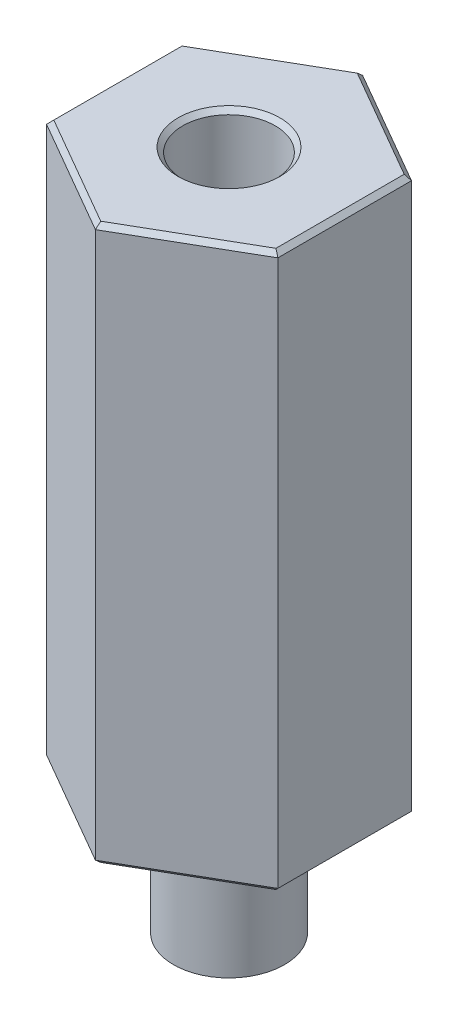
ISO-10303-21;
HEADER;
FILE_DESCRIPTION(('STEP AP214'),'2;1');
FILE_NAME('part.step','',(''),(''),'','','');
FILE_SCHEMA(('AUTOMOTIVE_DESIGN { 1 0 10303 214 1 1 1 1 }'));
ENDSEC;
DATA;
#1=APPLICATION_CONTEXT('core data for automotive mechanical design processes');
#2=APPLICATION_PROTOCOL_DEFINITION('international standard','automotive_design',2000,#1);
#3=PRODUCT_CONTEXT('',#1,'mechanical');
#4=PRODUCT('Part','Part','',(#3));
#5=PRODUCT_RELATED_PRODUCT_CATEGORY('part','',(#4));
#6=PRODUCT_DEFINITION_FORMATION('','',#4);
#7=PRODUCT_DEFINITION_CONTEXT('part definition',#1,'design');
#8=PRODUCT_DEFINITION('design','',#6,#7);
#9=PRODUCT_DEFINITION_SHAPE('','',#8);
#10=(LENGTH_UNIT() NAMED_UNIT(*) SI_UNIT(.MILLI.,.METRE.));
#11=(NAMED_UNIT(*) PLANE_ANGLE_UNIT() SI_UNIT($,.RADIAN.));
#12=(NAMED_UNIT(*) SI_UNIT($,.STERADIAN.) SOLID_ANGLE_UNIT());
#13=UNCERTAINTY_MEASURE_WITH_UNIT(LENGTH_MEASURE(1.E-05),#10,'distance_accuracy_value','');
#14=(GEOMETRIC_REPRESENTATION_CONTEXT(3) GLOBAL_UNCERTAINTY_ASSIGNED_CONTEXT((#13)) GLOBAL_UNIT_ASSIGNED_CONTEXT((#10,
#11,#12)) REPRESENTATION_CONTEXT('',''));
#15=CARTESIAN_POINT('',(0.,0.,0.));
#16=DIRECTION('',(0.,0.,1.));
#17=DIRECTION('',(1.,0.,0.));
#18=AXIS2_PLACEMENT_3D('',#15,#16,#17);
#19=CARTESIAN_POINT('',(0.,0.,0.));
#20=DIRECTION('',(0.,1.,0.));
#21=DIRECTION('',(0.,0.,1.));
#22=AXIS2_PLACEMENT_3D('',#19,#20,#21);
#23=CYLINDRICAL_SURFACE('',#22,1.);
#24=CARTESIAN_POINT('',(0.,11.9,0.));
#25=DIRECTION('',(0.,1.,0.));
#26=DIRECTION('',(0.,0.,1.));
#27=AXIS2_PLACEMENT_3D('',#24,#25,#26);
#28=CIRCLE('',#27,1.);
#29=CARTESIAN_POINT('',(0.,11.9,1.));
#30=VERTEX_POINT('',#29);
#31=EDGE_CURVE('E180',#30,#30,#28,.T.);
#32=ORIENTED_EDGE('',*,*,#31,.T.);
#33=EDGE_LOOP('',(#32));
#34=FACE_BOUND('',#33,.T.);
#35=CARTESIAN_POINT('',(0.,2.7,0.));
#36=DIRECTION('',(0.,-1.,0.));
#37=DIRECTION('',(0.,0.,-1.));
#38=AXIS2_PLACEMENT_3D('',#35,#36,#37);
#39=CIRCLE('',#38,1.);
#40=CARTESIAN_POINT('',(0.,2.7,-1.));
#41=VERTEX_POINT('',#40);
#42=EDGE_CURVE('E11',#41,#41,#39,.F.);
#43=ORIENTED_EDGE('',*,*,#42,.F.);
#44=EDGE_LOOP('',(#43));
#45=FACE_BOUND('',#44,.T.);
#46=ADVANCED_FACE('F33',(#34,#45),#23,.F.);
#47=CARTESIAN_POINT('',(2.49999999999998,12.,-1.44337567297409));
#48=DIRECTION('',(-0.499999999999995,0.,0.866025403784442));
#49=DIRECTION('',(0.866025403784442,0.,0.499999999999995));
#50=AXIS2_PLACEMENT_3D('',#47,#48,#49);
#51=PLANE('',#50);
#52=DIRECTION('',(0.,-1.,0.));
#53=VECTOR('',#52,1.);
#54=CARTESIAN_POINT('',(0.,12.,-2.88675134594812));
#55=LINE('',#54,#53);
#56=CARTESIAN_POINT('',(0.,11.9,-2.88675134594812));
#57=VERTEX_POINT('',#56);
#58=CARTESIAN_POINT('',(0.,0.100000000000001,-2.88675134594812));
#59=VERTEX_POINT('',#58);
#60=EDGE_CURVE('E251',#57,#59,#55,.T.);
#61=ORIENTED_EDGE('',*,*,#60,.F.);
#62=DIRECTION('',(0.866025403784442,0.,0.499999999999995));
#63=VECTOR('',#62,1.);
#64=CARTESIAN_POINT('',(2.49999999999998,11.9,-1.44337567297409));
#65=LINE('',#64,#63);
#66=CARTESIAN_POINT('',(2.49999999999998,11.9,-1.44337567297409));
#67=VERTEX_POINT('',#66);
#68=EDGE_CURVE('E178',#57,#67,#65,.T.);
#69=ORIENTED_EDGE('',*,*,#68,.T.);
#70=DIRECTION('',(0.,-1.,0.));
#71=VECTOR('',#70,1.);
#72=CARTESIAN_POINT('',(2.49999999999998,12.,-1.44337567297409));
#73=LINE('',#72,#71);
#74=CARTESIAN_POINT('',(2.49999999999998,0.100000000000001,-1.44337567297409));
#75=VERTEX_POINT('',#74);
#76=EDGE_CURVE('E203',#67,#75,#73,.T.);
#77=ORIENTED_EDGE('',*,*,#76,.T.);
#78=DIRECTION('',(-0.866025403784442,0.,-0.499999999999995));
#79=VECTOR('',#78,1.);
#80=CARTESIAN_POINT('',(2.49999999999998,0.100000000000001,-1.44337567297409));
#81=LINE('',#80,#79);
#82=EDGE_CURVE('E176',#75,#59,#81,.T.);
#83=ORIENTED_EDGE('',*,*,#82,.T.);
#84=EDGE_LOOP('',(#61,#69,#77,#83));
#85=FACE_BOUND('',#84,.T.);
#86=ADVANCED_FACE('F308',(#85),#51,.F.);
#87=CARTESIAN_POINT('',(0.,12.,-2.88675134594812));
#88=DIRECTION('',(0.500000000000001,0.,0.866025403784438));
#89=DIRECTION('',(0.866025403784438,0.,-0.500000000000001));
#90=AXIS2_PLACEMENT_3D('',#87,#88,#89);
#91=PLANE('',#90);
#92=DIRECTION('',(0.,-1.,0.));
#93=VECTOR('',#92,1.);
#94=CARTESIAN_POINT('',(-2.5,12.,-1.44337567297406));
#95=LINE('',#94,#93);
#96=CARTESIAN_POINT('',(-2.5,11.9,-1.44337567297406));
#97=VERTEX_POINT('',#96);
#98=CARTESIAN_POINT('',(-2.5,0.100000000000001,-1.44337567297406));
#99=VERTEX_POINT('',#98);
#100=EDGE_CURVE('E243',#97,#99,#95,.T.);
#101=ORIENTED_EDGE('',*,*,#100,.F.);
#102=DIRECTION('',(0.866025403784438,0.,-0.500000000000001));
#103=VECTOR('',#102,1.);
#104=CARTESIAN_POINT('',(0.,11.9,-2.88675134594812));
#105=LINE('',#104,#103);
#106=EDGE_CURVE('E174',#97,#57,#105,.T.);
#107=ORIENTED_EDGE('',*,*,#106,.T.);
#108=ORIENTED_EDGE('',*,*,#60,.T.);
#109=DIRECTION('',(-0.866025403784438,0.,0.500000000000001));
#110=VECTOR('',#109,1.);
#111=CARTESIAN_POINT('',(0.,0.100000000000001,-2.88675134594812));
#112=LINE('',#111,#110);
#113=EDGE_CURVE('E172',#59,#99,#112,.T.);
#114=ORIENTED_EDGE('',*,*,#113,.T.);
#115=EDGE_LOOP('',(#101,#107,#108,#114));
#116=FACE_BOUND('',#115,.T.);
#117=ADVANCED_FACE('F313',(#116),#91,.F.);
#118=CARTESIAN_POINT('',(-2.5,12.,-1.44337567297406));
#119=DIRECTION('',(1.,0.,0.));
#120=DIRECTION('',(0.,0.,-1.));
#121=AXIS2_PLACEMENT_3D('',#118,#119,#120);
#122=PLANE('',#121);
#123=DIRECTION('',(0.,-1.,0.));
#124=VECTOR('',#123,1.);
#125=CARTESIAN_POINT('',(-2.49999999999999,12.,1.44337567297407));
#126=LINE('',#125,#124);
#127=CARTESIAN_POINT('',(-2.49999999999999,11.9,1.44337567297407));
#128=VERTEX_POINT('',#127);
#129=CARTESIAN_POINT('',(-2.49999999999999,0.100000000000001,1.44337567297407));
#130=VERTEX_POINT('',#129);
#131=EDGE_CURVE('E240',#128,#130,#126,.T.);
#132=ORIENTED_EDGE('',*,*,#131,.F.);
#133=DIRECTION('',(0.,0.,-1.));
#134=VECTOR('',#133,1.);
#135=CARTESIAN_POINT('',(-2.5,11.9,-1.44337567297406));
#136=LINE('',#135,#134);
#137=EDGE_CURVE('E170',#128,#97,#136,.T.);
#138=ORIENTED_EDGE('',*,*,#137,.T.);
#139=ORIENTED_EDGE('',*,*,#100,.T.);
#140=DIRECTION('',(0.,0.,1.));
#141=VECTOR('',#140,1.);
#142=CARTESIAN_POINT('',(-2.5,0.100000000000001,-1.44337567297406));
#143=LINE('',#142,#141);
#144=EDGE_CURVE('E168',#99,#130,#143,.T.);
#145=ORIENTED_EDGE('',*,*,#144,.T.);
#146=EDGE_LOOP('',(#132,#138,#139,#145));
#147=FACE_BOUND('',#146,.T.);
#148=ADVANCED_FACE('F239',(#147),#122,.F.);
#149=CARTESIAN_POINT('',(-2.49999999999999,12.,1.44337567297407));
#150=DIRECTION('',(0.499999999999995,0.,-0.866025403784442));
#151=DIRECTION('',(-0.866025403784442,0.,-0.499999999999995));
#152=AXIS2_PLACEMENT_3D('',#149,#150,#151);
#153=PLANE('',#152);
#154=DIRECTION('',(0.,-1.,0.));
#155=VECTOR('',#154,1.);
#156=CARTESIAN_POINT('',(0.,12.,2.88675134594812));
#157=LINE('',#156,#155);
#158=CARTESIAN_POINT('',(0.,11.9,2.88675134594812));
#159=VERTEX_POINT('',#158);
#160=CARTESIAN_POINT('',(0.,0.100000000000001,2.88675134594812));
#161=VERTEX_POINT('',#160);
#162=EDGE_CURVE('E249',#159,#161,#157,.T.);
#163=ORIENTED_EDGE('',*,*,#162,.F.);
#164=DIRECTION('',(-0.866025403784442,0.,-0.499999999999995));
#165=VECTOR('',#164,1.);
#166=CARTESIAN_POINT('',(-2.49999999999999,11.9,1.44337567297407));
#167=LINE('',#166,#165);
#168=EDGE_CURVE('E166',#159,#128,#167,.T.);
#169=ORIENTED_EDGE('',*,*,#168,.T.);
#170=ORIENTED_EDGE('',*,*,#131,.T.);
#171=DIRECTION('',(0.866025403784442,0.,0.499999999999995));
#172=VECTOR('',#171,1.);
#173=CARTESIAN_POINT('',(-2.49999999999999,0.100000000000001,1.44337567297407));
#174=LINE('',#173,#172);
#175=EDGE_CURVE('E163',#130,#161,#174,.T.);
#176=ORIENTED_EDGE('',*,*,#175,.T.);
#177=EDGE_LOOP('',(#163,#169,#170,#176));
#178=FACE_BOUND('',#177,.T.);
#179=ADVANCED_FACE('F246',(#178),#153,.F.);
#180=CARTESIAN_POINT('',(0.,12.,2.88675134594812));
#181=DIRECTION('',(-0.500000000000007,0.,-0.866025403784434));
#182=DIRECTION('',(-0.866025403784435,0.,0.500000000000007));
#183=AXIS2_PLACEMENT_3D('',#180,#181,#182);
#184=PLANE('',#183);
#185=DIRECTION('',(0.,-1.,0.));
#186=VECTOR('',#185,1.);
#187=CARTESIAN_POINT('',(2.50000000000001,12.,1.44337567297404));
#188=LINE('',#187,#186);
#189=CARTESIAN_POINT('',(2.50000000000001,11.9,1.44337567297404));
#190=VERTEX_POINT('',#189);
#191=CARTESIAN_POINT('',(2.50000000000001,0.100000000000001,1.44337567297404));
#192=VERTEX_POINT('',#191);
#193=EDGE_CURVE('E253',#190,#192,#188,.T.);
#194=ORIENTED_EDGE('',*,*,#193,.F.);
#195=DIRECTION('',(-0.866025403784435,0.,0.500000000000007));
#196=VECTOR('',#195,1.);
#197=CARTESIAN_POINT('',(0.,11.9,2.88675134594812));
#198=LINE('',#197,#196);
#199=EDGE_CURVE('E161',#190,#159,#198,.T.);
#200=ORIENTED_EDGE('',*,*,#199,.T.);
#201=ORIENTED_EDGE('',*,*,#162,.T.);
#202=DIRECTION('',(0.866025403784435,0.,-0.500000000000007));
#203=VECTOR('',#202,1.);
#204=CARTESIAN_POINT('',(0.,0.100000000000001,2.88675134594812));
#205=LINE('',#204,#203);
#206=EDGE_CURVE('E159',#161,#192,#205,.T.);
#207=ORIENTED_EDGE('',*,*,#206,.T.);
#208=EDGE_LOOP('',(#194,#200,#201,#207));
#209=FACE_BOUND('',#208,.T.);
#210=ADVANCED_FACE('F280',(#209),#184,.F.);
#211=CARTESIAN_POINT('',(2.50000000000001,12.,1.44337567297404));
#212=DIRECTION('',(-1.,0.,0.));
#213=DIRECTION('',(0.,0.,1.));
#214=AXIS2_PLACEMENT_3D('',#211,#212,#213);
#215=PLANE('',#214);
#216=ORIENTED_EDGE('',*,*,#76,.F.);
#217=DIRECTION('',(0.,0.,1.));
#218=VECTOR('',#217,1.);
#219=CARTESIAN_POINT('',(2.50000000000001,11.9,1.44337567297404));
#220=LINE('',#219,#218);
#221=EDGE_CURVE('E130',#67,#190,#220,.T.);
#222=ORIENTED_EDGE('',*,*,#221,.T.);
#223=ORIENTED_EDGE('',*,*,#193,.T.);
#224=DIRECTION('',(0.,0.,-1.));
#225=VECTOR('',#224,1.);
#226=CARTESIAN_POINT('',(2.50000000000001,0.100000000000001,1.44337567297404));
#227=LINE('',#226,#225);
#228=EDGE_CURVE('E151',#192,#75,#227,.T.);
#229=ORIENTED_EDGE('',*,*,#228,.T.);
#230=EDGE_LOOP('',(#216,#222,#223,#229));
#231=FACE_BOUND('',#230,.T.);
#232=ADVANCED_FACE('F277',(#231),#215,.F.);
#233=CARTESIAN_POINT('',(0.,12.,0.));
#234=DIRECTION('',(0.,1.,0.));
#235=DIRECTION('',(0.,0.,1.));
#236=AXIS2_PLACEMENT_3D('',#233,#234,#235);
#237=PLANE('',#236);
#238=DIRECTION('',(0.866025403784435,0.,-0.500000000000007));
#239=VECTOR('',#238,1.);
#240=CARTESIAN_POINT('',(2.45000000000001,12.,1.35677313259559));
#241=LINE('',#240,#239);
#242=CARTESIAN_POINT('',(0.,12.,2.7712812921102));
#243=VERTEX_POINT('',#242);
#244=CARTESIAN_POINT('',(2.40000000000001,12.,1.38564064605508));
#245=VERTEX_POINT('',#244);
#246=EDGE_CURVE('E149',#243,#245,#241,.T.);
#247=ORIENTED_EDGE('',*,*,#246,.T.);
#248=DIRECTION('',(0.,0.,-1.));
#249=VECTOR('',#248,1.);
#250=CARTESIAN_POINT('',(2.39999999999998,12.,-1.44337567297409));
#251=LINE('',#250,#249);
#252=CARTESIAN_POINT('',(2.39999999999998,12.,-1.38564064605513));
#253=VERTEX_POINT('',#252);
#254=EDGE_CURVE('E128',#245,#253,#251,.T.);
#255=ORIENTED_EDGE('',*,*,#254,.T.);
#256=DIRECTION('',(-0.866025403784442,0.,-0.499999999999995));
#257=VECTOR('',#256,1.);
#258=CARTESIAN_POINT('',(-0.05,12.,-2.80014880556968));
#259=LINE('',#258,#257);
#260=CARTESIAN_POINT('',(0.,12.,-2.7712812921102));
#261=VERTEX_POINT('',#260);
#262=EDGE_CURVE('E137',#253,#261,#259,.T.);
#263=ORIENTED_EDGE('',*,*,#262,.T.);
#264=DIRECTION('',(-0.866025403784438,0.,0.500000000000001));
#265=VECTOR('',#264,1.);
#266=CARTESIAN_POINT('',(-2.45,12.,-1.35677313259561));
#267=LINE('',#266,#265);
#268=CARTESIAN_POINT('',(-2.4,12.,-1.38564064605509));
#269=VERTEX_POINT('',#268);
#270=EDGE_CURVE('E143',#261,#269,#267,.T.);
#271=ORIENTED_EDGE('',*,*,#270,.T.);
#272=DIRECTION('',(0.,0.,1.));
#273=VECTOR('',#272,1.);
#274=CARTESIAN_POINT('',(-2.39999999999999,12.,1.44337567297407));
#275=LINE('',#274,#273);
#276=CARTESIAN_POINT('',(-2.39999999999999,12.,1.38564064605511));
#277=VERTEX_POINT('',#276);
#278=EDGE_CURVE('E262',#269,#277,#275,.T.);
#279=ORIENTED_EDGE('',*,*,#278,.T.);
#280=DIRECTION('',(0.866025403784442,0.,0.499999999999995));
#281=VECTOR('',#280,1.);
#282=CARTESIAN_POINT('',(0.0500000000000196,12.,2.80014880556968));
#283=LINE('',#282,#281);
#284=EDGE_CURVE('E154',#277,#243,#283,.T.);
#285=ORIENTED_EDGE('',*,*,#284,.T.);
#286=EDGE_LOOP('',(#247,#255,#263,#271,#279,#285));
#287=FACE_BOUND('',#286,.T.);
#288=CARTESIAN_POINT('',(0.,12.,0.));
#289=DIRECTION('',(0.,1.,0.));
#290=DIRECTION('',(0.,0.,1.));
#291=AXIS2_PLACEMENT_3D('',#288,#289,#290);
#292=CIRCLE('',#291,1.1);
#293=CARTESIAN_POINT('',(0.,12.,1.1));
#294=VERTEX_POINT('',#293);
#295=EDGE_CURVE('E144',#294,#294,#292,.F.);
#296=ORIENTED_EDGE('',*,*,#295,.T.);
#297=EDGE_LOOP('',(#296));
#298=FACE_BOUND('',#297,.T.);
#299=ADVANCED_FACE('F146',(#287,#298),#237,.T.);
#300=CARTESIAN_POINT('',(0.,0.,0.));
#301=DIRECTION('',(0.,1.,0.));
#302=DIRECTION('',(0.,0.,1.));
#303=AXIS2_PLACEMENT_3D('',#300,#301,#302);
#304=PLANE('',#303);
#305=CARTESIAN_POINT('',(0.,0.,0.));
#306=DIRECTION('',(0.,1.,0.));
#307=DIRECTION('',(0.,0.,1.));
#308=AXIS2_PLACEMENT_3D('',#305,#306,#307);
#309=CIRCLE('',#308,1.2);
#310=CARTESIAN_POINT('',(0.,0.,-1.2));
#311=VERTEX_POINT('',#310);
#312=EDGE_CURVE('E37',#311,#311,#309,.T.);
#313=ORIENTED_EDGE('',*,*,#312,.T.);
#314=EDGE_LOOP('',(#313));
#315=FACE_BOUND('',#314,.T.);
#316=DIRECTION('',(-0.866025403784435,0.,0.500000000000007));
#317=VECTOR('',#316,1.);
#318=CARTESIAN_POINT('',(1.20000000000001,0.,2.07846096908264));
#319=LINE('',#318,#317);
#320=CARTESIAN_POINT('',(2.40000000000001,0.,1.38564064605508));
#321=VERTEX_POINT('',#320);
#322=CARTESIAN_POINT('',(0.,0.,2.7712812921102));
#323=VERTEX_POINT('',#322);
#324=EDGE_CURVE('E49',#321,#323,#319,.T.);
#325=ORIENTED_EDGE('',*,*,#324,.T.);
#326=DIRECTION('',(-0.866025403784442,0.,-0.499999999999995));
#327=VECTOR('',#326,1.);
#328=CARTESIAN_POINT('',(-1.19999999999998,0.,2.07846096908265));
#329=LINE('',#328,#327);
#330=CARTESIAN_POINT('',(-2.39999999999999,0.,1.38564064605511));
#331=VERTEX_POINT('',#330);
#332=EDGE_CURVE('E42',#323,#331,#329,.T.);
#333=ORIENTED_EDGE('',*,*,#332,.T.);
#334=DIRECTION('',(0.,0.,-1.));
#335=VECTOR('',#334,1.);
#336=CARTESIAN_POINT('',(-2.39999999999999,0.,0.));
#337=LINE('',#336,#335);
#338=CARTESIAN_POINT('',(-2.4,0.,-1.38564064605509));
#339=VERTEX_POINT('',#338);
#340=EDGE_CURVE('E183',#331,#339,#337,.T.);
#341=ORIENTED_EDGE('',*,*,#340,.T.);
#342=DIRECTION('',(0.866025403784438,0.,-0.500000000000001));
#343=VECTOR('',#342,1.);
#344=CARTESIAN_POINT('',(-1.2,0.,-2.07846096908265));
#345=LINE('',#344,#343);
#346=CARTESIAN_POINT('',(0.,0.,-2.7712812921102));
#347=VERTEX_POINT('',#346);
#348=EDGE_CURVE('E185',#339,#347,#345,.T.);
#349=ORIENTED_EDGE('',*,*,#348,.T.);
#350=DIRECTION('',(0.866025403784442,0.,0.499999999999995));
#351=VECTOR('',#350,1.);
#352=CARTESIAN_POINT('',(1.19999999999999,0.,-2.07846096908266));
#353=LINE('',#352,#351);
#354=CARTESIAN_POINT('',(2.39999999999998,0.,-1.38564064605513));
#355=VERTEX_POINT('',#354);
#356=EDGE_CURVE('E187',#347,#355,#353,.T.);
#357=ORIENTED_EDGE('',*,*,#356,.T.);
#358=DIRECTION('',(0.,0.,1.));
#359=VECTOR('',#358,1.);
#360=CARTESIAN_POINT('',(2.39999999999999,0.,0.));
#361=LINE('',#360,#359);
#362=EDGE_CURVE('E54',#355,#321,#361,.T.);
#363=ORIENTED_EDGE('',*,*,#362,.T.);
#364=EDGE_LOOP('',(#325,#333,#341,#349,#357,#363));
#365=FACE_BOUND('',#364,.T.);
#366=ADVANCED_FACE('F228',(#315,#365),#304,.F.);
#367=CARTESIAN_POINT('',(-2.39999999999999,12.,0.));
#368=DIRECTION('',(-0.707106781186549,0.707106781186546,0.));
#369=DIRECTION('',(0.,0.,-1.));
#370=AXIS2_PLACEMENT_3D('',#367,#368,#369);
#371=PLANE('',#370);
#372=DIRECTION('',(0.654653670707977,0.654653670707978,0.377964473009226));
#373=VECTOR('',#372,1.);
#374=CARTESIAN_POINT('',(-2.05714285714286,12.3428571428571,-1.18769198233294));
#375=LINE('',#374,#373);
#376=EDGE_CURVE('E197',#97,#269,#375,.T.);
#377=ORIENTED_EDGE('',*,*,#376,.F.);
#378=ORIENTED_EDGE('',*,*,#137,.F.);
#379=DIRECTION('',(0.654653670707975,0.65465367070798,-0.377964473009226));
#380=VECTOR('',#379,1.);
#381=CARTESIAN_POINT('',(-2.05714285714285,12.3428571428571,1.18769198233296));
#382=LINE('',#381,#380);
#383=EDGE_CURVE('E200',#277,#128,#382,.F.);
#384=ORIENTED_EDGE('',*,*,#383,.F.);
#385=ORIENTED_EDGE('',*,*,#278,.F.);
#386=EDGE_LOOP('',(#377,#378,#384,#385));
#387=FACE_BOUND('',#386,.T.);
#388=ADVANCED_FACE('F322',(#387),#371,.T.);
#389=CARTESIAN_POINT('',(-1.19999999999999,12.,2.07846096908265));
#390=DIRECTION('',(-0.353553390593272,0.707106781186544,0.612372435695799));
#391=DIRECTION('',(-0.866025403784442,0.,-0.499999999999995));
#392=AXIS2_PLACEMENT_3D('',#389,#390,#391);
#393=PLANE('',#392);
#394=ORIENTED_EDGE('',*,*,#383,.T.);
#395=ORIENTED_EDGE('',*,*,#168,.F.);
#396=DIRECTION('',(0.,0.654653670707979,-0.755928946018453));
#397=VECTOR('',#396,1.);
#398=CARTESIAN_POINT('',(0.,12.3428571428571,2.37538396466588));
#399=LINE('',#398,#397);
#400=EDGE_CURVE('E194',#243,#159,#399,.F.);
#401=ORIENTED_EDGE('',*,*,#400,.F.);
#402=ORIENTED_EDGE('',*,*,#284,.F.);
#403=EDGE_LOOP('',(#394,#395,#401,#402));
#404=FACE_BOUND('',#403,.T.);
#405=ADVANCED_FACE('F268',(#404),#393,.T.);
#406=CARTESIAN_POINT('',(-1.2,12.,-2.07846096908265));
#407=DIRECTION('',(-0.353553390593275,0.707106781186546,-0.612372435695795));
#408=DIRECTION('',(0.866025403784438,0.,-0.500000000000001));
#409=AXIS2_PLACEMENT_3D('',#406,#407,#408);
#410=PLANE('',#409);
#411=ORIENTED_EDGE('',*,*,#376,.T.);
#412=ORIENTED_EDGE('',*,*,#270,.F.);
#413=DIRECTION('',(0.,0.654653670707979,0.755928946018453));
#414=VECTOR('',#413,1.);
#415=CARTESIAN_POINT('',(0.,12.3428571428571,-2.37538396466589));
#416=LINE('',#415,#414);
#417=EDGE_CURVE('E140',#57,#261,#416,.T.);
#418=ORIENTED_EDGE('',*,*,#417,.F.);
#419=ORIENTED_EDGE('',*,*,#106,.F.);
#420=EDGE_LOOP('',(#411,#412,#418,#419));
#421=FACE_BOUND('',#420,.T.);
#422=ADVANCED_FACE('F341',(#421),#410,.T.);
#423=CARTESIAN_POINT('',(1.20000000000001,12.,2.07846096908264));
#424=DIRECTION('',(0.353553390593279,0.707106781186547,0.612372435695792));
#425=DIRECTION('',(-0.866025403784435,0.,0.500000000000007));
#426=AXIS2_PLACEMENT_3D('',#423,#424,#425);
#427=PLANE('',#426);
#428=ORIENTED_EDGE('',*,*,#400,.T.);
#429=ORIENTED_EDGE('',*,*,#199,.F.);
#430=DIRECTION('',(-0.654653670707976,0.654653670707979,-0.377964473009226));
#431=VECTOR('',#430,1.);
#432=CARTESIAN_POINT('',(2.05714285714287,12.3428571428571,1.18769198233292));
#433=LINE('',#432,#431);
#434=EDGE_CURVE('E133',#245,#190,#433,.F.);
#435=ORIENTED_EDGE('',*,*,#434,.F.);
#436=ORIENTED_EDGE('',*,*,#246,.F.);
#437=EDGE_LOOP('',(#428,#429,#435,#436));
#438=FACE_BOUND('',#437,.T.);
#439=ADVANCED_FACE('F271',(#438),#427,.T.);
#440=CARTESIAN_POINT('',(1.19999999999999,12.,-2.07846096908266));
#441=DIRECTION('',(0.353553390593271,0.707106781186546,-0.612372435695798));
#442=DIRECTION('',(0.866025403784442,0.,0.499999999999995));
#443=AXIS2_PLACEMENT_3D('',#440,#441,#442);
#444=PLANE('',#443);
#445=ORIENTED_EDGE('',*,*,#417,.T.);
#446=ORIENTED_EDGE('',*,*,#262,.F.);
#447=DIRECTION('',(0.654653670707969,-0.65465367070798,-0.377964473009235));
#448=VECTOR('',#447,1.);
#449=CARTESIAN_POINT('',(2.05714285714285,12.3428571428571,-1.18769198233297));
#450=LINE('',#449,#448);
#451=EDGE_CURVE('E124',#67,#253,#450,.F.);
#452=ORIENTED_EDGE('',*,*,#451,.F.);
#453=ORIENTED_EDGE('',*,*,#68,.F.);
#454=EDGE_LOOP('',(#445,#446,#452,#453));
#455=FACE_BOUND('',#454,.T.);
#456=ADVANCED_FACE('F138',(#455),#444,.T.);
#457=CARTESIAN_POINT('',(2.39999999999999,12.,0.));
#458=DIRECTION('',(0.707106781186551,0.707106781186544,0.));
#459=DIRECTION('',(0.,0.,1.));
#460=AXIS2_PLACEMENT_3D('',#457,#458,#459);
#461=PLANE('',#460);
#462=ORIENTED_EDGE('',*,*,#434,.T.);
#463=ORIENTED_EDGE('',*,*,#221,.F.);
#464=ORIENTED_EDGE('',*,*,#451,.T.);
#465=ORIENTED_EDGE('',*,*,#254,.F.);
#466=EDGE_LOOP('',(#462,#463,#464,#465));
#467=FACE_BOUND('',#466,.T.);
#468=ADVANCED_FACE('F126',(#467),#461,.T.);
#469=CARTESIAN_POINT('',(0.,11.9,0.));
#470=DIRECTION('',(0.,1.,0.));
#471=DIRECTION('',(0.,0.,1.));
#472=AXIS2_PLACEMENT_3D('',#469,#470,#471);
#473=CONICAL_SURFACE('',#472,1.,0.785398163397444);
#474=ORIENTED_EDGE('',*,*,#295,.F.);
#475=EDGE_LOOP('',(#474));
#476=FACE_BOUND('',#475,.T.);
#477=ORIENTED_EDGE('',*,*,#31,.F.);
#478=EDGE_LOOP('',(#477));
#479=FACE_BOUND('',#478,.T.);
#480=ADVANCED_FACE('F336',(#476,#479),#473,.F.);
#481=CARTESIAN_POINT('',(2.49999999999998,0.100000000000001,-1.44337567297409));
#482=DIRECTION('',(-0.353553390593271,0.707106781186546,0.612372435695798));
#483=DIRECTION('',(-0.866025403784442,0.,-0.499999999999995));
#484=AXIS2_PLACEMENT_3D('',#481,#482,#483);
#485=PLANE('',#484);
#486=DIRECTION('',(-0.654653670707973,-0.654653670707979,0.377964473009231));
#487=VECTOR('',#486,1.);
#488=CARTESIAN_POINT('',(2.49999999999998,0.100000000000001,-1.44337567297409));
#489=LINE('',#488,#487);
#490=EDGE_CURVE('E214',#355,#75,#489,.F.);
#491=ORIENTED_EDGE('',*,*,#490,.F.);
#492=ORIENTED_EDGE('',*,*,#356,.F.);
#493=DIRECTION('',(0.,-0.654653670707979,0.755928946018453));
#494=VECTOR('',#493,1.);
#495=CARTESIAN_POINT('',(0.,0.100000000000001,-2.88675134594812));
#496=LINE('',#495,#494);
#497=EDGE_CURVE('E134',#59,#347,#496,.T.);
#498=ORIENTED_EDGE('',*,*,#497,.F.);
#499=ORIENTED_EDGE('',*,*,#82,.F.);
#500=EDGE_LOOP('',(#491,#492,#498,#499));
#501=FACE_BOUND('',#500,.T.);
#502=ADVANCED_FACE('F35',(#501),#485,.F.);
#503=CARTESIAN_POINT('',(0.,0.100000000000001,-2.88675134594812));
#504=DIRECTION('',(0.353553390593275,0.707106781186546,0.612372435695795));
#505=DIRECTION('',(-0.866025403784438,0.,0.500000000000001));
#506=AXIS2_PLACEMENT_3D('',#503,#504,#505);
#507=PLANE('',#506);
#508=ORIENTED_EDGE('',*,*,#497,.T.);
#509=ORIENTED_EDGE('',*,*,#348,.F.);
#510=DIRECTION('',(0.654653670707979,-0.654653670707978,0.377964473009224));
#511=VECTOR('',#510,1.);
#512=CARTESIAN_POINT('',(-2.5,0.100000000000001,-1.44337567297406));
#513=LINE('',#512,#511);
#514=EDGE_CURVE('E211',#99,#339,#513,.T.);
#515=ORIENTED_EDGE('',*,*,#514,.F.);
#516=ORIENTED_EDGE('',*,*,#113,.F.);
#517=EDGE_LOOP('',(#508,#509,#515,#516));
#518=FACE_BOUND('',#517,.T.);
#519=ADVANCED_FACE('F222',(#518),#507,.F.);
#520=CARTESIAN_POINT('',(2.50000000000001,0.100000000000001,1.44337567297404));
#521=DIRECTION('',(-0.707106781186548,0.707106781186547,0.));
#522=DIRECTION('',(0.,0.,-1.));
#523=AXIS2_PLACEMENT_3D('',#520,#521,#522);
#524=PLANE('',#523);
#525=ORIENTED_EDGE('',*,*,#490,.T.);
#526=ORIENTED_EDGE('',*,*,#228,.F.);
#527=DIRECTION('',(-0.65465367070798,-0.654653670707977,-0.377964473009222));
#528=VECTOR('',#527,1.);
#529=CARTESIAN_POINT('',(2.50000000000001,0.100000000000001,1.44337567297404));
#530=LINE('',#529,#528);
#531=EDGE_CURVE('E208',#321,#192,#530,.F.);
#532=ORIENTED_EDGE('',*,*,#531,.F.);
#533=ORIENTED_EDGE('',*,*,#362,.F.);
#534=EDGE_LOOP('',(#525,#526,#532,#533));
#535=FACE_BOUND('',#534,.T.);
#536=ADVANCED_FACE('F362',(#535),#524,.F.);
#537=CARTESIAN_POINT('',(-2.5,0.100000000000001,-1.44337567297406));
#538=DIRECTION('',(0.707106781186547,0.707106781186547,0.));
#539=DIRECTION('',(0.,0.,1.));
#540=AXIS2_PLACEMENT_3D('',#537,#538,#539);
#541=PLANE('',#540);
#542=ORIENTED_EDGE('',*,*,#514,.T.);
#543=ORIENTED_EDGE('',*,*,#340,.F.);
#544=DIRECTION('',(-0.654653670707976,0.654653670707977,0.37796447300923));
#545=VECTOR('',#544,1.);
#546=CARTESIAN_POINT('',(-1.78571428571427,-0.614285714285715,1.03098262355291));
#547=LINE('',#546,#545);
#548=EDGE_CURVE('E206',#130,#331,#547,.F.);
#549=ORIENTED_EDGE('',*,*,#548,.F.);
#550=ORIENTED_EDGE('',*,*,#144,.F.);
#551=EDGE_LOOP('',(#542,#543,#549,#550));
#552=FACE_BOUND('',#551,.T.);
#553=ADVANCED_FACE('F232',(#552),#541,.F.);
#554=CARTESIAN_POINT('',(0.,0.100000000000001,2.88675134594812));
#555=DIRECTION('',(-0.353553390593279,0.707106781186547,-0.612372435695792));
#556=DIRECTION('',(0.866025403784435,0.,-0.500000000000007));
#557=AXIS2_PLACEMENT_3D('',#554,#555,#556);
#558=PLANE('',#557);
#559=ORIENTED_EDGE('',*,*,#531,.T.);
#560=ORIENTED_EDGE('',*,*,#206,.F.);
#561=DIRECTION('',(0.,-0.654653670707977,-0.755928946018455));
#562=VECTOR('',#561,1.);
#563=CARTESIAN_POINT('',(0.,0.100000000000001,2.88675134594812));
#564=LINE('',#563,#562);
#565=EDGE_CURVE('E204',#323,#161,#564,.F.);
#566=ORIENTED_EDGE('',*,*,#565,.F.);
#567=ORIENTED_EDGE('',*,*,#324,.F.);
#568=EDGE_LOOP('',(#559,#560,#566,#567));
#569=FACE_BOUND('',#568,.T.);
#570=ADVANCED_FACE('F355',(#569),#558,.F.);
#571=CARTESIAN_POINT('',(-2.49999999999999,0.100000000000001,1.44337567297407));
#572=DIRECTION('',(0.35355339059327,0.707106781186547,-0.612372435695797));
#573=DIRECTION('',(0.866025403784442,0.,0.499999999999995));
#574=AXIS2_PLACEMENT_3D('',#571,#572,#573);
#575=PLANE('',#574);
#576=ORIENTED_EDGE('',*,*,#548,.T.);
#577=ORIENTED_EDGE('',*,*,#332,.F.);
#578=ORIENTED_EDGE('',*,*,#565,.T.);
#579=ORIENTED_EDGE('',*,*,#175,.F.);
#580=EDGE_LOOP('',(#576,#577,#578,#579));
#581=FACE_BOUND('',#580,.T.);
#582=ADVANCED_FACE('F303',(#581),#575,.F.);
#583=CARTESIAN_POINT('',(0.,2.7,0.));
#584=DIRECTION('',(0.,-1.,0.));
#585=DIRECTION('',(0.,0.,-1.));
#586=AXIS2_PLACEMENT_3D('',#583,#584,#585);
#587=PLANE('',#586);
#588=ORIENTED_EDGE('',*,*,#42,.T.);
#589=EDGE_LOOP('',(#588));
#590=FACE_BOUND('',#589,.T.);
#591=ADVANCED_FACE('F295',(#590),#587,.F.);
#592=CARTESIAN_POINT('',(0.,2.7,0.));
#593=DIRECTION('',(0.,-1.,0.));
#594=DIRECTION('',(0.,0.,-1.));
#595=AXIS2_PLACEMENT_3D('',#592,#593,#594);
#596=CYLINDRICAL_SURFACE('',#595,1.2);
#597=CARTESIAN_POINT('',(0.,-2.7,0.));
#598=DIRECTION('',(0.,-1.,0.));
#599=DIRECTION('',(0.,0.,-1.));
#600=AXIS2_PLACEMENT_3D('',#597,#598,#599);
#601=CIRCLE('',#600,1.2);
#602=CARTESIAN_POINT('',(0.,-2.7,-1.2));
#603=VERTEX_POINT('',#602);
#604=EDGE_CURVE('E284',#603,#603,#601,.T.);
#605=CARTESIAN_POINT('',(0.,-2.7,-1.2));
#606=CARTESIAN_POINT('',(0.,-2.671875,-1.2));
#607=CARTESIAN_POINT('',(0.,-2.64375,-1.2));
#608=CARTESIAN_POINT('',(0.,-2.5875,-1.2));
#609=CARTESIAN_POINT('',(0.,-2.559375,-1.2));
#610=CARTESIAN_POINT('',(0.,-2.503125,-1.2));
#611=CARTESIAN_POINT('',(0.,-2.475,-1.2));
#612=CARTESIAN_POINT('',(0.,-2.41875,-1.2));
#613=CARTESIAN_POINT('',(0.,-2.390625,-1.2));
#614=CARTESIAN_POINT('',(0.,-2.334375,-1.2));
#615=CARTESIAN_POINT('',(0.,-2.30625,-1.2));
#616=CARTESIAN_POINT('',(0.,-2.25,-1.2));
#617=CARTESIAN_POINT('',(0.,-2.221875,-1.2));
#618=CARTESIAN_POINT('',(0.,-2.165625,-1.2));
#619=CARTESIAN_POINT('',(0.,-2.1375,-1.2));
#620=CARTESIAN_POINT('',(0.,-2.08125,-1.2));
#621=CARTESIAN_POINT('',(0.,-2.053125,-1.2));
#622=CARTESIAN_POINT('',(0.,-1.996875,-1.2));
#623=CARTESIAN_POINT('',(0.,-1.96875,-1.2));
#624=CARTESIAN_POINT('',(0.,-1.9125,-1.2));
#625=CARTESIAN_POINT('',(0.,-1.884375,-1.2));
#626=CARTESIAN_POINT('',(0.,-1.828125,-1.2));
#627=CARTESIAN_POINT('',(0.,-1.8,-1.2));
#628=CARTESIAN_POINT('',(0.,-1.74375,-1.2));
#629=CARTESIAN_POINT('',(0.,-1.715625,-1.2));
#630=CARTESIAN_POINT('',(0.,-1.659375,-1.2));
#631=CARTESIAN_POINT('',(0.,-1.63125,-1.2));
#632=CARTESIAN_POINT('',(0.,-1.575,-1.2));
#633=CARTESIAN_POINT('',(0.,-1.546875,-1.2));
#634=CARTESIAN_POINT('',(0.,-1.490625,-1.2));
#635=CARTESIAN_POINT('',(0.,-1.4625,-1.2));
#636=CARTESIAN_POINT('',(0.,-1.40625,-1.2));
#637=CARTESIAN_POINT('',(0.,-1.378125,-1.2));
#638=CARTESIAN_POINT('',(0.,-1.321875,-1.2));
#639=CARTESIAN_POINT('',(0.,-1.29375,-1.2));
#640=CARTESIAN_POINT('',(0.,-1.2375,-1.2));
#641=CARTESIAN_POINT('',(0.,-1.209375,-1.2));
#642=CARTESIAN_POINT('',(0.,-1.153125,-1.2));
#643=CARTESIAN_POINT('',(0.,-1.125,-1.2));
#644=CARTESIAN_POINT('',(0.,-1.06875,-1.2));
#645=CARTESIAN_POINT('',(0.,-1.040625,-1.2));
#646=CARTESIAN_POINT('',(0.,-0.984375,-1.2));
#647=CARTESIAN_POINT('',(0.,-0.95625,-1.2));
#648=CARTESIAN_POINT('',(0.,-0.9,-1.2));
#649=CARTESIAN_POINT('',(0.,-0.871875,-1.2));
#650=CARTESIAN_POINT('',(0.,-0.815625,-1.2));
#651=CARTESIAN_POINT('',(0.,-0.7875,-1.2));
#652=CARTESIAN_POINT('',(0.,-0.73125,-1.2));
#653=CARTESIAN_POINT('',(0.,-0.703125,-1.2));
#654=CARTESIAN_POINT('',(0.,-0.646875,-1.2));
#655=CARTESIAN_POINT('',(0.,-0.61875,-1.2));
#656=CARTESIAN_POINT('',(0.,-0.5625,-1.2));
#657=CARTESIAN_POINT('',(0.,-0.534375,-1.2));
#658=CARTESIAN_POINT('',(0.,-0.478125,-1.2));
#659=CARTESIAN_POINT('',(0.,-0.45,-1.2));
#660=CARTESIAN_POINT('',(0.,-0.39375,-1.2));
#661=CARTESIAN_POINT('',(0.,-0.365625,-1.2));
#662=CARTESIAN_POINT('',(0.,-0.309375,-1.2));
#663=CARTESIAN_POINT('',(0.,-0.28125,-1.2));
#664=CARTESIAN_POINT('',(0.,-0.225,-1.2));
#665=CARTESIAN_POINT('',(0.,-0.196875,-1.2));
#666=CARTESIAN_POINT('',(0.,-0.140625,-1.2));
#667=CARTESIAN_POINT('',(0.,-0.1125,-1.2));
#668=CARTESIAN_POINT('',(0.,-0.0562500000000003,-1.2));
#669=CARTESIAN_POINT('',(0.,-0.0281250000000003,-1.2));
#670=CARTESIAN_POINT('',(0.,0.,-1.2));
#671=B_SPLINE_CURVE_WITH_KNOTS('',3,(#605,#606,#607,#608,#609,#610,#611,#612,#613,#614,#615,
#616,#617,#618,#619,#620,#621,#622,#623,#624,#625,#626,#627,#628,#629,#630,#631,#632,#633,#634,
#635,#636,#637,#638,#639,#640,#641,#642,#643,#644,#645,#646,#647,#648,#649,#650,#651,#652,#653,
#654,#655,#656,#657,#658,#659,#660,#661,#662,#663,#664,#665,#666,#667,#668,#669,#670),
.UNSPECIFIED.,.F.,.F.,(4,2,2,2,2,2,2,2,2,2,2,2,2,2,2,2,2,2,2,2,2,2,2,2,2,2,2,2,2,2,2,2,4),(0.,
0.0843750000000003,0.16875,0.253125,0.3375,0.421875,0.50625,0.590625,0.675,0.759375,0.84375,
0.928125,1.0125,1.096875,1.18125,1.265625,1.35,1.434375,1.51875,1.603125,1.6875,1.771875,
1.85625,1.940625,2.025,2.109375,2.19375,2.278125,2.3625,2.446875,2.53125,2.615625,2.7),.UNSPECIFIED.);
#672=EDGE_CURVE('BSEAM292',#603,#311,#671,.T.);
#673=ORIENTED_EDGE('',*,*,#604,.F.);
#674=ORIENTED_EDGE('',*,*,#312,.F.);
#675=ORIENTED_EDGE('',*,*,#672,.T.);
#676=ORIENTED_EDGE('',*,*,#672,.F.);
#677=EDGE_LOOP('',(#673,#675,#674,#676));
#678=FACE_BOUND('',#677,.T.);
#679=ADVANCED_FACE('F292',(#678),#596,.T.);
#680=CARTESIAN_POINT('',(0.,-2.7,0.));
#681=DIRECTION('',(0.,-1.,0.));
#682=DIRECTION('',(0.,0.,-1.));
#683=AXIS2_PLACEMENT_3D('',#680,#681,#682);
#684=PLANE('',#683);
#685=ORIENTED_EDGE('',*,*,#604,.T.);
#686=EDGE_LOOP('',(#685));
#687=FACE_BOUND('',#686,.T.);
#688=ADVANCED_FACE('F294',(#687),#684,.T.);
#689=CLOSED_SHELL('',(#46,#86,#117,#148,#179,#210,#232,#299,#366,#388,#405,#422,#439,#456,#468,
#480,#502,#519,#536,#553,#570,#582,#591,#679,#688));
#690=MANIFOLD_SOLID_BREP('B2',#689);
#691=ADVANCED_BREP_SHAPE_REPRESENTATION('',(#18,#690),#14);
#692=SHAPE_DEFINITION_REPRESENTATION(#9,#691);
ENDSEC;
END-ISO-10303-21;
